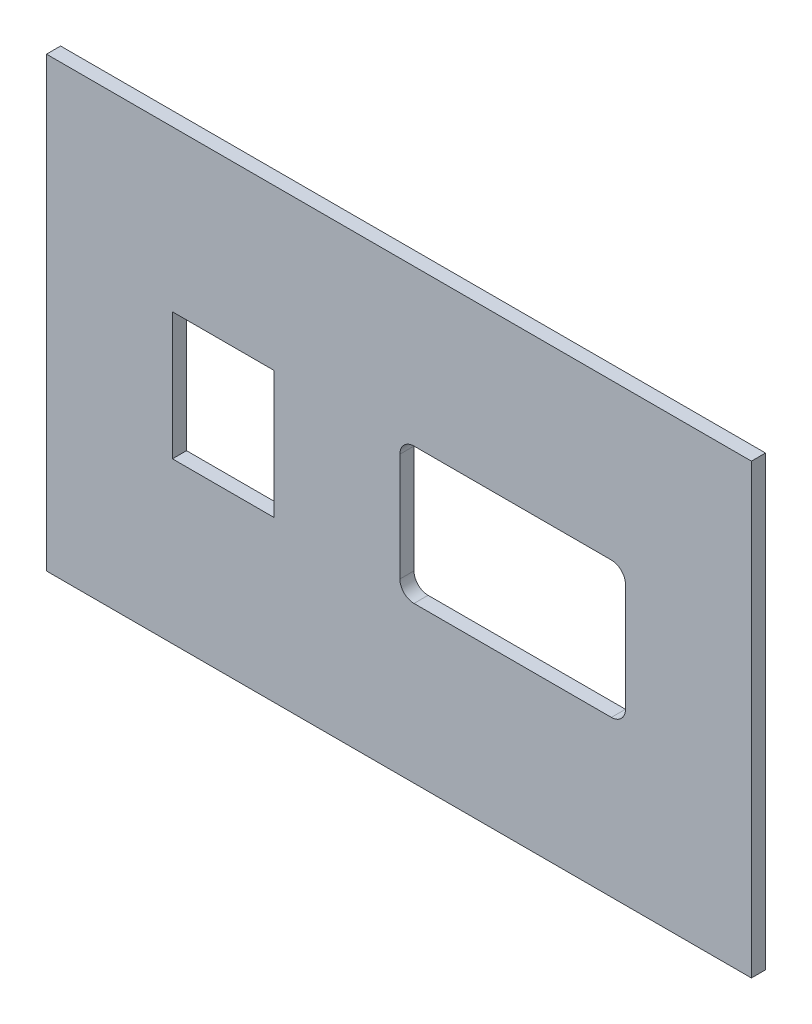
ISO-10303-21;
HEADER;
FILE_DESCRIPTION(('STEP AP214'),'2;1');
FILE_NAME('part.step','',(''),(''),'','','');
FILE_SCHEMA(('AUTOMOTIVE_DESIGN { 1 0 10303 214 1 1 1 1 }'));
ENDSEC;
DATA;
#1=APPLICATION_CONTEXT('core data for automotive mechanical design processes');
#2=APPLICATION_PROTOCOL_DEFINITION('international standard','automotive_design',2000,#1);
#3=PRODUCT_CONTEXT('',#1,'mechanical');
#4=PRODUCT('Part','Part','',(#3));
#5=PRODUCT_RELATED_PRODUCT_CATEGORY('part','',(#4));
#6=PRODUCT_DEFINITION_FORMATION('','',#4);
#7=PRODUCT_DEFINITION_CONTEXT('part definition',#1,'design');
#8=PRODUCT_DEFINITION('design','',#6,#7);
#9=PRODUCT_DEFINITION_SHAPE('','',#8);
#10=(LENGTH_UNIT() NAMED_UNIT(*) SI_UNIT(.MILLI.,.METRE.));
#11=(NAMED_UNIT(*) PLANE_ANGLE_UNIT() SI_UNIT($,.RADIAN.));
#12=(NAMED_UNIT(*) SI_UNIT($,.STERADIAN.) SOLID_ANGLE_UNIT());
#13=UNCERTAINTY_MEASURE_WITH_UNIT(LENGTH_MEASURE(1.E-05),#10,'distance_accuracy_value','');
#14=(GEOMETRIC_REPRESENTATION_CONTEXT(3) GLOBAL_UNCERTAINTY_ASSIGNED_CONTEXT((#13)) GLOBAL_UNIT_ASSIGNED_CONTEXT((#10,
#11,#12)) REPRESENTATION_CONTEXT('',''));
#15=CARTESIAN_POINT('',(0.,0.,0.));
#16=DIRECTION('',(0.,0.,1.));
#17=DIRECTION('',(1.,0.,0.));
#18=AXIS2_PLACEMENT_3D('',#15,#16,#17);
#19=CARTESIAN_POINT('',(-75.,-47.625,3.));
#20=DIRECTION('',(0.,1.,0.));
#21=DIRECTION('',(0.,0.,1.));
#22=AXIS2_PLACEMENT_3D('',#19,#20,#21);
#23=PLANE('',#22);
#24=DIRECTION('',(1.,0.,0.));
#25=VECTOR('',#24,1.);
#26=CARTESIAN_POINT('',(-75.,-47.625,0.));
#27=LINE('',#26,#25);
#28=CARTESIAN_POINT('',(-75.,-47.625,0.));
#29=VERTEX_POINT('',#28);
#30=CARTESIAN_POINT('',(75.,-47.625,0.));
#31=VERTEX_POINT('',#30);
#32=EDGE_CURVE('E156',#29,#31,#27,.T.);
#33=ORIENTED_EDGE('',*,*,#32,.T.);
#34=DIRECTION('',(0.,0.,-1.));
#35=VECTOR('',#34,1.);
#36=CARTESIAN_POINT('',(75.,-47.625,3.));
#37=LINE('',#36,#35);
#38=CARTESIAN_POINT('',(75.,-47.625,3.));
#39=VERTEX_POINT('',#38);
#40=EDGE_CURVE('E11',#39,#31,#37,.T.);
#41=ORIENTED_EDGE('',*,*,#40,.F.);
#42=DIRECTION('',(1.,0.,0.));
#43=VECTOR('',#42,1.);
#44=CARTESIAN_POINT('',(-75.,-47.625,3.));
#45=LINE('',#44,#43);
#46=CARTESIAN_POINT('',(-75.,-47.625,3.));
#47=VERTEX_POINT('',#46);
#48=EDGE_CURVE('E247',#47,#39,#45,.T.);
#49=ORIENTED_EDGE('',*,*,#48,.F.);
#50=DIRECTION('',(0.,0.,-1.));
#51=VECTOR('',#50,1.);
#52=CARTESIAN_POINT('',(-75.,-47.625,3.));
#53=LINE('',#52,#51);
#54=EDGE_CURVE('E258',#47,#29,#53,.T.);
#55=ORIENTED_EDGE('',*,*,#54,.T.);
#56=EDGE_LOOP('',(#33,#41,#49,#55));
#57=FACE_BOUND('',#56,.T.);
#58=ADVANCED_FACE('F35',(#57),#23,.F.);
#59=CARTESIAN_POINT('',(75.,47.625,3.));
#60=DIRECTION('',(1.,0.,0.));
#61=DIRECTION('',(0.,1.,0.));
#62=AXIS2_PLACEMENT_3D('',#59,#60,#61);
#63=PLANE('',#62);
#64=DIRECTION('',(0.,-1.,0.));
#65=VECTOR('',#64,1.);
#66=CARTESIAN_POINT('',(75.,47.625,0.));
#67=LINE('',#66,#65);
#68=CARTESIAN_POINT('',(75.,47.625,0.));
#69=VERTEX_POINT('',#68);
#70=EDGE_CURVE('E261',#69,#31,#67,.T.);
#71=ORIENTED_EDGE('',*,*,#70,.F.);
#72=DIRECTION('',(0.,0.,-1.));
#73=VECTOR('',#72,1.);
#74=CARTESIAN_POINT('',(75.,47.625,3.));
#75=LINE('',#74,#73);
#76=CARTESIAN_POINT('',(75.,47.625,3.));
#77=VERTEX_POINT('',#76);
#78=EDGE_CURVE('E42',#77,#69,#75,.T.);
#79=ORIENTED_EDGE('',*,*,#78,.F.);
#80=DIRECTION('',(0.,-1.,0.));
#81=VECTOR('',#80,1.);
#82=CARTESIAN_POINT('',(75.,47.625,3.));
#83=LINE('',#82,#81);
#84=EDGE_CURVE('E249',#77,#39,#83,.T.);
#85=ORIENTED_EDGE('',*,*,#84,.T.);
#86=ORIENTED_EDGE('',*,*,#40,.T.);
#87=EDGE_LOOP('',(#71,#79,#85,#86));
#88=FACE_BOUND('',#87,.T.);
#89=ADVANCED_FACE('F278',(#88),#63,.T.);
#90=CARTESIAN_POINT('',(-75.,47.625,3.));
#91=DIRECTION('',(0.,1.,0.));
#92=DIRECTION('',(0.,0.,1.));
#93=AXIS2_PLACEMENT_3D('',#90,#91,#92);
#94=PLANE('',#93);
#95=DIRECTION('',(1.,0.,0.));
#96=VECTOR('',#95,1.);
#97=CARTESIAN_POINT('',(-75.,47.625,0.));
#98=LINE('',#97,#96);
#99=CARTESIAN_POINT('',(-75.,47.625,0.));
#100=VERTEX_POINT('',#99);
#101=EDGE_CURVE('E264',#100,#69,#98,.T.);
#102=ORIENTED_EDGE('',*,*,#101,.F.);
#103=DIRECTION('',(0.,0.,-1.));
#104=VECTOR('',#103,1.);
#105=CARTESIAN_POINT('',(-75.,47.625,3.));
#106=LINE('',#105,#104);
#107=CARTESIAN_POINT('',(-75.,47.625,3.));
#108=VERTEX_POINT('',#107);
#109=EDGE_CURVE('E270',#108,#100,#106,.T.);
#110=ORIENTED_EDGE('',*,*,#109,.F.);
#111=DIRECTION('',(1.,0.,0.));
#112=VECTOR('',#111,1.);
#113=CARTESIAN_POINT('',(-75.,47.625,3.));
#114=LINE('',#113,#112);
#115=EDGE_CURVE('E253',#108,#77,#114,.T.);
#116=ORIENTED_EDGE('',*,*,#115,.T.);
#117=ORIENTED_EDGE('',*,*,#78,.T.);
#118=EDGE_LOOP('',(#102,#110,#116,#117));
#119=FACE_BOUND('',#118,.T.);
#120=ADVANCED_FACE('F274',(#119),#94,.T.);
#121=CARTESIAN_POINT('',(-75.,47.625,3.));
#122=DIRECTION('',(1.,0.,0.));
#123=DIRECTION('',(0.,1.,0.));
#124=AXIS2_PLACEMENT_3D('',#121,#122,#123);
#125=PLANE('',#124);
#126=DIRECTION('',(0.,-1.,0.));
#127=VECTOR('',#126,1.);
#128=CARTESIAN_POINT('',(-75.,47.625,0.));
#129=LINE('',#128,#127);
#130=EDGE_CURVE('E250',#100,#29,#129,.T.);
#131=ORIENTED_EDGE('',*,*,#130,.T.);
#132=ORIENTED_EDGE('',*,*,#54,.F.);
#133=DIRECTION('',(0.,-1.,0.));
#134=VECTOR('',#133,1.);
#135=CARTESIAN_POINT('',(-75.,47.625,3.));
#136=LINE('',#135,#134);
#137=EDGE_CURVE('E256',#108,#47,#136,.T.);
#138=ORIENTED_EDGE('',*,*,#137,.F.);
#139=ORIENTED_EDGE('',*,*,#109,.T.);
#140=EDGE_LOOP('',(#131,#132,#138,#139));
#141=FACE_BOUND('',#140,.T.);
#142=ADVANCED_FACE('F286',(#141),#125,.F.);
#143=CARTESIAN_POINT('',(0.,0.,3.));
#144=DIRECTION('',(0.,0.,-1.));
#145=DIRECTION('',(-1.,0.,0.));
#146=AXIS2_PLACEMENT_3D('',#143,#144,#145);
#147=PLANE('',#146);
#148=CARTESIAN_POINT('',(3.19999999999995,11.5,3.));
#149=DIRECTION('',(0.,0.,1.));
#150=DIRECTION('',(1.,0.,0.));
#151=AXIS2_PLACEMENT_3D('',#148,#149,#150);
#152=CIRCLE('',#151,3.);
#153=CARTESIAN_POINT('',(3.19999999999995,14.5,3.));
#154=VERTEX_POINT('',#153);
#155=CARTESIAN_POINT('',(0.199999999999948,11.5,3.));
#156=VERTEX_POINT('',#155);
#157=EDGE_CURVE('E150',#154,#156,#152,.T.);
#158=ORIENTED_EDGE('',*,*,#157,.F.);
#159=DIRECTION('',(1.,0.,0.));
#160=VECTOR('',#159,1.);
#161=CARTESIAN_POINT('',(0.,14.5,3.));
#162=LINE('',#161,#160);
#163=CARTESIAN_POINT('',(45.1999999999999,14.5,3.));
#164=VERTEX_POINT('',#163);
#165=EDGE_CURVE('E160',#154,#164,#162,.T.);
#166=ORIENTED_EDGE('',*,*,#165,.T.);
#167=CARTESIAN_POINT('',(45.1999999999999,11.5,3.));
#168=DIRECTION('',(0.,0.,1.));
#169=DIRECTION('',(1.,0.,0.));
#170=AXIS2_PLACEMENT_3D('',#167,#168,#169);
#171=CIRCLE('',#170,3.);
#172=CARTESIAN_POINT('',(48.2,11.5,3.));
#173=VERTEX_POINT('',#172);
#174=EDGE_CURVE('E184',#164,#173,#171,.F.);
#175=ORIENTED_EDGE('',*,*,#174,.T.);
#176=DIRECTION('',(0.,-1.,0.));
#177=VECTOR('',#176,1.);
#178=CARTESIAN_POINT('',(48.1999999999999,0.,3.));
#179=LINE('',#178,#177);
#180=CARTESIAN_POINT('',(48.1999999999999,-11.5,3.));
#181=VERTEX_POINT('',#180);
#182=EDGE_CURVE('E49',#173,#181,#179,.T.);
#183=ORIENTED_EDGE('',*,*,#182,.T.);
#184=CARTESIAN_POINT('',(45.1999999999999,-11.5,3.));
#185=DIRECTION('',(0.,0.,1.));
#186=DIRECTION('',(1.,0.,0.));
#187=AXIS2_PLACEMENT_3D('',#184,#185,#186);
#188=CIRCLE('',#187,3.);
#189=CARTESIAN_POINT('',(45.1999999999999,-14.5,3.));
#190=VERTEX_POINT('',#189);
#191=EDGE_CURVE('E181',#190,#181,#188,.T.);
#192=ORIENTED_EDGE('',*,*,#191,.F.);
#193=DIRECTION('',(1.,0.,0.));
#194=VECTOR('',#193,1.);
#195=CARTESIAN_POINT('',(0.,-14.5,3.));
#196=LINE('',#195,#194);
#197=CARTESIAN_POINT('',(3.19999999999995,-14.5,3.));
#198=VERTEX_POINT('',#197);
#199=EDGE_CURVE('E179',#198,#190,#196,.T.);
#200=ORIENTED_EDGE('',*,*,#199,.F.);
#201=CARTESIAN_POINT('',(3.19999999999995,-11.5,3.));
#202=DIRECTION('',(0.,0.,1.));
#203=DIRECTION('',(1.,0.,0.));
#204=AXIS2_PLACEMENT_3D('',#201,#202,#203);
#205=CIRCLE('',#204,3.);
#206=CARTESIAN_POINT('',(0.199999999999952,-11.5,3.));
#207=VERTEX_POINT('',#206);
#208=EDGE_CURVE('E175',#207,#198,#205,.T.);
#209=ORIENTED_EDGE('',*,*,#208,.F.);
#210=DIRECTION('',(0.,-1.,0.));
#211=VECTOR('',#210,1.);
#212=CARTESIAN_POINT('',(0.19999999999995,0.,3.));
#213=LINE('',#212,#211);
#214=EDGE_CURVE('E173',#156,#207,#213,.T.);
#215=ORIENTED_EDGE('',*,*,#214,.F.);
#216=EDGE_LOOP('',(#158,#166,#175,#183,#192,#200,#209,#215));
#217=FACE_BOUND('',#216,.T.);
#218=DIRECTION('',(1.,0.,0.));
#219=VECTOR('',#218,1.);
#220=CARTESIAN_POINT('',(0.,13.55,3.));
#221=LINE('',#220,#219);
#222=CARTESIAN_POINT('',(-48.2,13.55,3.));
#223=VERTEX_POINT('',#222);
#224=CARTESIAN_POINT('',(-26.6,13.55,3.));
#225=VERTEX_POINT('',#224);
#226=EDGE_CURVE('E222',#223,#225,#221,.T.);
#227=ORIENTED_EDGE('',*,*,#226,.T.);
#228=DIRECTION('',(0.,-1.,0.));
#229=VECTOR('',#228,1.);
#230=CARTESIAN_POINT('',(-26.6,0.,3.));
#231=LINE('',#230,#229);
#232=CARTESIAN_POINT('',(-26.6,-13.55,3.));
#233=VERTEX_POINT('',#232);
#234=EDGE_CURVE('E219',#225,#233,#231,.T.);
#235=ORIENTED_EDGE('',*,*,#234,.T.);
#236=DIRECTION('',(1.,0.,0.));
#237=VECTOR('',#236,1.);
#238=CARTESIAN_POINT('',(0.,-13.55,3.));
#239=LINE('',#238,#237);
#240=CARTESIAN_POINT('',(-48.2,-13.55,3.));
#241=VERTEX_POINT('',#240);
#242=EDGE_CURVE('E228',#241,#233,#239,.T.);
#243=ORIENTED_EDGE('',*,*,#242,.F.);
#244=DIRECTION('',(0.,-1.,0.));
#245=VECTOR('',#244,1.);
#246=CARTESIAN_POINT('',(-48.2,0.,3.));
#247=LINE('',#246,#245);
#248=EDGE_CURVE('E226',#223,#241,#247,.T.);
#249=ORIENTED_EDGE('',*,*,#248,.F.);
#250=EDGE_LOOP('',(#227,#235,#243,#249));
#251=FACE_BOUND('',#250,.T.);
#252=ORIENTED_EDGE('',*,*,#48,.T.);
#253=ORIENTED_EDGE('',*,*,#84,.F.);
#254=ORIENTED_EDGE('',*,*,#115,.F.);
#255=ORIENTED_EDGE('',*,*,#137,.T.);
#256=EDGE_LOOP('',(#252,#253,#254,#255));
#257=FACE_BOUND('',#256,.T.);
#258=ADVANCED_FACE('F170',(#217,#251,#257),#147,.F.);
#259=CARTESIAN_POINT('',(0.,0.,0.));
#260=DIRECTION('',(0.,0.,-1.));
#261=DIRECTION('',(-1.,0.,0.));
#262=AXIS2_PLACEMENT_3D('',#259,#260,#261);
#263=PLANE('',#262);
#264=DIRECTION('',(1.,0.,0.));
#265=VECTOR('',#264,1.);
#266=CARTESIAN_POINT('',(0.,14.5,0.));
#267=LINE('',#266,#265);
#268=CARTESIAN_POINT('',(3.19999999999995,14.5,0.));
#269=VERTEX_POINT('',#268);
#270=CARTESIAN_POINT('',(45.1999999999999,14.5,0.));
#271=VERTEX_POINT('',#270);
#272=EDGE_CURVE('E186',#269,#271,#267,.T.);
#273=ORIENTED_EDGE('',*,*,#272,.F.);
#274=CARTESIAN_POINT('',(3.19999999999995,11.5,0.));
#275=DIRECTION('',(0.,0.,1.));
#276=DIRECTION('',(1.,0.,0.));
#277=AXIS2_PLACEMENT_3D('',#274,#275,#276);
#278=CIRCLE('',#277,3.);
#279=CARTESIAN_POINT('',(0.199999999999948,11.5,0.));
#280=VERTEX_POINT('',#279);
#281=EDGE_CURVE('E153',#269,#280,#278,.T.);
#282=ORIENTED_EDGE('',*,*,#281,.T.);
#283=DIRECTION('',(0.,-1.,0.));
#284=VECTOR('',#283,1.);
#285=CARTESIAN_POINT('',(0.19999999999995,0.,0.));
#286=LINE('',#285,#284);
#287=CARTESIAN_POINT('',(0.199999999999952,-11.5,0.));
#288=VERTEX_POINT('',#287);
#289=EDGE_CURVE('E190',#280,#288,#286,.T.);
#290=ORIENTED_EDGE('',*,*,#289,.T.);
#291=CARTESIAN_POINT('',(3.19999999999995,-11.5,0.));
#292=DIRECTION('',(0.,0.,1.));
#293=DIRECTION('',(1.,0.,0.));
#294=AXIS2_PLACEMENT_3D('',#291,#292,#293);
#295=CIRCLE('',#294,3.);
#296=CARTESIAN_POINT('',(3.19999999999995,-14.5,0.));
#297=VERTEX_POINT('',#296);
#298=EDGE_CURVE('E193',#288,#297,#295,.T.);
#299=ORIENTED_EDGE('',*,*,#298,.T.);
#300=DIRECTION('',(1.,0.,0.));
#301=VECTOR('',#300,1.);
#302=CARTESIAN_POINT('',(0.,-14.5,0.));
#303=LINE('',#302,#301);
#304=CARTESIAN_POINT('',(45.1999999999999,-14.5,0.));
#305=VERTEX_POINT('',#304);
#306=EDGE_CURVE('E196',#297,#305,#303,.T.);
#307=ORIENTED_EDGE('',*,*,#306,.T.);
#308=CARTESIAN_POINT('',(45.1999999999999,-11.5,0.));
#309=DIRECTION('',(0.,0.,1.));
#310=DIRECTION('',(1.,0.,0.));
#311=AXIS2_PLACEMENT_3D('',#308,#309,#310);
#312=CIRCLE('',#311,3.);
#313=CARTESIAN_POINT('',(48.1999999999999,-11.5,0.));
#314=VERTEX_POINT('',#313);
#315=EDGE_CURVE('E199',#305,#314,#312,.T.);
#316=ORIENTED_EDGE('',*,*,#315,.T.);
#317=DIRECTION('',(0.,-1.,0.));
#318=VECTOR('',#317,1.);
#319=CARTESIAN_POINT('',(48.1999999999999,0.,0.));
#320=LINE('',#319,#318);
#321=CARTESIAN_POINT('',(48.2,11.5,0.));
#322=VERTEX_POINT('',#321);
#323=EDGE_CURVE('E202',#322,#314,#320,.T.);
#324=ORIENTED_EDGE('',*,*,#323,.F.);
#325=CARTESIAN_POINT('',(45.1999999999999,11.5,0.));
#326=DIRECTION('',(0.,0.,1.));
#327=DIRECTION('',(1.,0.,0.));
#328=AXIS2_PLACEMENT_3D('',#325,#326,#327);
#329=CIRCLE('',#328,3.);
#330=EDGE_CURVE('E167',#271,#322,#329,.F.);
#331=ORIENTED_EDGE('',*,*,#330,.F.);
#332=EDGE_LOOP('',(#273,#282,#290,#299,#307,#316,#324,#331));
#333=FACE_BOUND('',#332,.T.);
#334=DIRECTION('',(0.,-1.,0.));
#335=VECTOR('',#334,1.);
#336=CARTESIAN_POINT('',(-26.6,0.,0.));
#337=LINE('',#336,#335);
#338=CARTESIAN_POINT('',(-26.6,13.55,0.));
#339=VERTEX_POINT('',#338);
#340=CARTESIAN_POINT('',(-26.6,-13.55,0.));
#341=VERTEX_POINT('',#340);
#342=EDGE_CURVE('E231',#339,#341,#337,.T.);
#343=ORIENTED_EDGE('',*,*,#342,.F.);
#344=DIRECTION('',(1.,0.,0.));
#345=VECTOR('',#344,1.);
#346=CARTESIAN_POINT('',(0.,13.55,0.));
#347=LINE('',#346,#345);
#348=CARTESIAN_POINT('',(-48.2,13.55,0.));
#349=VERTEX_POINT('',#348);
#350=EDGE_CURVE('E233',#349,#339,#347,.T.);
#351=ORIENTED_EDGE('',*,*,#350,.F.);
#352=DIRECTION('',(0.,-1.,0.));
#353=VECTOR('',#352,1.);
#354=CARTESIAN_POINT('',(-48.2,0.,0.));
#355=LINE('',#354,#353);
#356=CARTESIAN_POINT('',(-48.2,-13.55,0.));
#357=VERTEX_POINT('',#356);
#358=EDGE_CURVE('E236',#349,#357,#355,.T.);
#359=ORIENTED_EDGE('',*,*,#358,.T.);
#360=DIRECTION('',(1.,0.,0.));
#361=VECTOR('',#360,1.);
#362=CARTESIAN_POINT('',(0.,-13.55,0.));
#363=LINE('',#362,#361);
#364=EDGE_CURVE('E223',#357,#341,#363,.T.);
#365=ORIENTED_EDGE('',*,*,#364,.T.);
#366=EDGE_LOOP('',(#343,#351,#359,#365));
#367=FACE_BOUND('',#366,.T.);
#368=ORIENTED_EDGE('',*,*,#32,.F.);
#369=ORIENTED_EDGE('',*,*,#130,.F.);
#370=ORIENTED_EDGE('',*,*,#101,.T.);
#371=ORIENTED_EDGE('',*,*,#70,.T.);
#372=EDGE_LOOP('',(#368,#369,#370,#371));
#373=FACE_BOUND('',#372,.T.);
#374=ADVANCED_FACE('F283',(#333,#367,#373),#263,.T.);
#375=CARTESIAN_POINT('',(-26.6,0.,3.));
#376=DIRECTION('',(1.,0.,0.));
#377=DIRECTION('',(0.,0.,-1.));
#378=AXIS2_PLACEMENT_3D('',#375,#376,#377);
#379=PLANE('',#378);
#380=ORIENTED_EDGE('',*,*,#342,.T.);
#381=DIRECTION('',(0.,0.,-1.));
#382=VECTOR('',#381,1.);
#383=CARTESIAN_POINT('',(-26.6,-13.55,3.));
#384=LINE('',#383,#382);
#385=EDGE_CURVE('E230',#233,#341,#384,.T.);
#386=ORIENTED_EDGE('',*,*,#385,.F.);
#387=ORIENTED_EDGE('',*,*,#234,.F.);
#388=DIRECTION('',(0.,0.,-1.));
#389=VECTOR('',#388,1.);
#390=CARTESIAN_POINT('',(-26.6,13.55,3.));
#391=LINE('',#390,#389);
#392=EDGE_CURVE('E188',#225,#339,#391,.T.);
#393=ORIENTED_EDGE('',*,*,#392,.T.);
#394=EDGE_LOOP('',(#380,#386,#387,#393));
#395=FACE_BOUND('',#394,.T.);
#396=ADVANCED_FACE('F297',(#395),#379,.F.);
#397=CARTESIAN_POINT('',(0.,13.55,3.));
#398=DIRECTION('',(0.,1.,0.));
#399=DIRECTION('',(-1.,0.,0.));
#400=AXIS2_PLACEMENT_3D('',#397,#398,#399);
#401=PLANE('',#400);
#402=ORIENTED_EDGE('',*,*,#350,.T.);
#403=ORIENTED_EDGE('',*,*,#392,.F.);
#404=ORIENTED_EDGE('',*,*,#226,.F.);
#405=DIRECTION('',(0.,0.,-1.));
#406=VECTOR('',#405,1.);
#407=CARTESIAN_POINT('',(-48.2,13.55,3.));
#408=LINE('',#407,#406);
#409=EDGE_CURVE('E244',#223,#349,#408,.T.);
#410=ORIENTED_EDGE('',*,*,#409,.T.);
#411=EDGE_LOOP('',(#402,#403,#404,#410));
#412=FACE_BOUND('',#411,.T.);
#413=ADVANCED_FACE('F335',(#412),#401,.F.);
#414=CARTESIAN_POINT('',(-48.2,0.,3.));
#415=DIRECTION('',(1.,0.,0.));
#416=DIRECTION('',(0.,1.,0.));
#417=AXIS2_PLACEMENT_3D('',#414,#415,#416);
#418=PLANE('',#417);
#419=ORIENTED_EDGE('',*,*,#358,.F.);
#420=ORIENTED_EDGE('',*,*,#409,.F.);
#421=ORIENTED_EDGE('',*,*,#248,.T.);
#422=DIRECTION('',(0.,0.,-1.));
#423=VECTOR('',#422,1.);
#424=CARTESIAN_POINT('',(-48.2,-13.55,3.));
#425=LINE('',#424,#423);
#426=EDGE_CURVE('E57',#241,#357,#425,.T.);
#427=ORIENTED_EDGE('',*,*,#426,.T.);
#428=EDGE_LOOP('',(#419,#420,#421,#427));
#429=FACE_BOUND('',#428,.T.);
#430=ADVANCED_FACE('F344',(#429),#418,.T.);
#431=CARTESIAN_POINT('',(0.,-13.55,3.));
#432=DIRECTION('',(0.,1.,0.));
#433=DIRECTION('',(0.,0.,1.));
#434=AXIS2_PLACEMENT_3D('',#431,#432,#433);
#435=PLANE('',#434);
#436=ORIENTED_EDGE('',*,*,#364,.F.);
#437=ORIENTED_EDGE('',*,*,#426,.F.);
#438=ORIENTED_EDGE('',*,*,#242,.T.);
#439=ORIENTED_EDGE('',*,*,#385,.T.);
#440=EDGE_LOOP('',(#436,#437,#438,#439));
#441=FACE_BOUND('',#440,.T.);
#442=ADVANCED_FACE('F354',(#441),#435,.T.);
#443=CARTESIAN_POINT('',(0.,14.5,3.));
#444=DIRECTION('',(0.,1.,0.));
#445=DIRECTION('',(-1.,0.,0.));
#446=AXIS2_PLACEMENT_3D('',#443,#444,#445);
#447=PLANE('',#446);
#448=ORIENTED_EDGE('',*,*,#272,.T.);
#449=DIRECTION('',(0.,0.,-1.));
#450=VECTOR('',#449,1.);
#451=CARTESIAN_POINT('',(45.1999999999999,14.5,3.));
#452=LINE('',#451,#450);
#453=EDGE_CURVE('E163',#164,#271,#452,.T.);
#454=ORIENTED_EDGE('',*,*,#453,.F.);
#455=ORIENTED_EDGE('',*,*,#165,.F.);
#456=DIRECTION('',(0.,0.,-1.));
#457=VECTOR('',#456,1.);
#458=CARTESIAN_POINT('',(3.19999999999995,14.5,3.));
#459=LINE('',#458,#457);
#460=EDGE_CURVE('E146',#154,#269,#459,.T.);
#461=ORIENTED_EDGE('',*,*,#460,.T.);
#462=EDGE_LOOP('',(#448,#454,#455,#461));
#463=FACE_BOUND('',#462,.T.);
#464=ADVANCED_FACE('F161',(#463),#447,.F.);
#465=CARTESIAN_POINT('',(3.19999999999995,11.5,3.));
#466=DIRECTION('',(0.,0.,-1.));
#467=DIRECTION('',(-1.,0.,0.));
#468=AXIS2_PLACEMENT_3D('',#465,#466,#467);
#469=CYLINDRICAL_SURFACE('',#468,3.);
#470=ORIENTED_EDGE('',*,*,#281,.F.);
#471=ORIENTED_EDGE('',*,*,#460,.F.);
#472=ORIENTED_EDGE('',*,*,#157,.T.);
#473=DIRECTION('',(0.,0.,-1.));
#474=VECTOR('',#473,1.);
#475=CARTESIAN_POINT('',(0.199999999999948,11.5,3.));
#476=LINE('',#475,#474);
#477=EDGE_CURVE('E157',#156,#280,#476,.T.);
#478=ORIENTED_EDGE('',*,*,#477,.T.);
#479=EDGE_LOOP('',(#470,#471,#472,#478));
#480=FACE_BOUND('',#479,.T.);
#481=ADVANCED_FACE('F148',(#480),#469,.F.);
#482=CARTESIAN_POINT('',(0.19999999999995,0.,3.));
#483=DIRECTION('',(1.,0.,0.));
#484=DIRECTION('',(0.,1.,0.));
#485=AXIS2_PLACEMENT_3D('',#482,#483,#484);
#486=PLANE('',#485);
#487=ORIENTED_EDGE('',*,*,#289,.F.);
#488=ORIENTED_EDGE('',*,*,#477,.F.);
#489=ORIENTED_EDGE('',*,*,#214,.T.);
#490=DIRECTION('',(0.,0.,-1.));
#491=VECTOR('',#490,1.);
#492=CARTESIAN_POINT('',(0.199999999999952,-11.5,3.));
#493=LINE('',#492,#491);
#494=EDGE_CURVE('E216',#207,#288,#493,.T.);
#495=ORIENTED_EDGE('',*,*,#494,.T.);
#496=EDGE_LOOP('',(#487,#488,#489,#495));
#497=FACE_BOUND('',#496,.T.);
#498=ADVANCED_FACE('F380',(#497),#486,.T.);
#499=CARTESIAN_POINT('',(3.19999999999995,-11.5,3.));
#500=DIRECTION('',(0.,0.,-1.));
#501=DIRECTION('',(-1.,0.,0.));
#502=AXIS2_PLACEMENT_3D('',#499,#500,#501);
#503=CYLINDRICAL_SURFACE('',#502,3.);
#504=ORIENTED_EDGE('',*,*,#298,.F.);
#505=ORIENTED_EDGE('',*,*,#494,.F.);
#506=ORIENTED_EDGE('',*,*,#208,.T.);
#507=DIRECTION('',(0.,0.,-1.));
#508=VECTOR('',#507,1.);
#509=CARTESIAN_POINT('',(3.19999999999995,-14.5,3.));
#510=LINE('',#509,#508);
#511=EDGE_CURVE('E214',#198,#297,#510,.T.);
#512=ORIENTED_EDGE('',*,*,#511,.T.);
#513=EDGE_LOOP('',(#504,#505,#506,#512));
#514=FACE_BOUND('',#513,.T.);
#515=ADVANCED_FACE('F389',(#514),#503,.F.);
#516=CARTESIAN_POINT('',(0.,-14.5,3.));
#517=DIRECTION('',(0.,1.,0.));
#518=DIRECTION('',(0.,0.,1.));
#519=AXIS2_PLACEMENT_3D('',#516,#517,#518);
#520=PLANE('',#519);
#521=ORIENTED_EDGE('',*,*,#306,.F.);
#522=ORIENTED_EDGE('',*,*,#511,.F.);
#523=ORIENTED_EDGE('',*,*,#199,.T.);
#524=DIRECTION('',(0.,0.,-1.));
#525=VECTOR('',#524,1.);
#526=CARTESIAN_POINT('',(45.1999999999999,-14.5,3.));
#527=LINE('',#526,#525);
#528=EDGE_CURVE('E212',#190,#305,#527,.T.);
#529=ORIENTED_EDGE('',*,*,#528,.T.);
#530=EDGE_LOOP('',(#521,#522,#523,#529));
#531=FACE_BOUND('',#530,.T.);
#532=ADVANCED_FACE('F399',(#531),#520,.T.);
#533=CARTESIAN_POINT('',(45.1999999999999,-11.5,3.));
#534=DIRECTION('',(0.,0.,-1.));
#535=DIRECTION('',(-1.,0.,0.));
#536=AXIS2_PLACEMENT_3D('',#533,#534,#535);
#537=CYLINDRICAL_SURFACE('',#536,3.);
#538=ORIENTED_EDGE('',*,*,#315,.F.);
#539=ORIENTED_EDGE('',*,*,#528,.F.);
#540=ORIENTED_EDGE('',*,*,#191,.T.);
#541=DIRECTION('',(0.,0.,-1.));
#542=VECTOR('',#541,1.);
#543=CARTESIAN_POINT('',(48.1999999999999,-11.5,3.));
#544=LINE('',#543,#542);
#545=EDGE_CURVE('E210',#181,#314,#544,.T.);
#546=ORIENTED_EDGE('',*,*,#545,.T.);
#547=EDGE_LOOP('',(#538,#539,#540,#546));
#548=FACE_BOUND('',#547,.T.);
#549=ADVANCED_FACE('F409',(#548),#537,.F.);
#550=CARTESIAN_POINT('',(48.1999999999999,0.,3.));
#551=DIRECTION('',(1.,0.,0.));
#552=DIRECTION('',(0.,1.,0.));
#553=AXIS2_PLACEMENT_3D('',#550,#551,#552);
#554=PLANE('',#553);
#555=ORIENTED_EDGE('',*,*,#323,.T.);
#556=ORIENTED_EDGE('',*,*,#545,.F.);
#557=ORIENTED_EDGE('',*,*,#182,.F.);
#558=DIRECTION('',(0.,0.,-1.));
#559=VECTOR('',#558,1.);
#560=CARTESIAN_POINT('',(48.2,11.5,3.));
#561=LINE('',#560,#559);
#562=EDGE_CURVE('E208',#173,#322,#561,.T.);
#563=ORIENTED_EDGE('',*,*,#562,.T.);
#564=EDGE_LOOP('',(#555,#556,#557,#563));
#565=FACE_BOUND('',#564,.T.);
#566=ADVANCED_FACE('F419',(#565),#554,.F.);
#567=CARTESIAN_POINT('',(45.1999999999999,11.5,3.));
#568=DIRECTION('',(0.,0.,-1.));
#569=DIRECTION('',(-1.,0.,0.));
#570=AXIS2_PLACEMENT_3D('',#567,#568,#569);
#571=CYLINDRICAL_SURFACE('',#570,3.);
#572=ORIENTED_EDGE('',*,*,#330,.T.);
#573=ORIENTED_EDGE('',*,*,#562,.F.);
#574=ORIENTED_EDGE('',*,*,#174,.F.);
#575=ORIENTED_EDGE('',*,*,#453,.T.);
#576=EDGE_LOOP('',(#572,#573,#574,#575));
#577=FACE_BOUND('',#576,.T.);
#578=ADVANCED_FACE('F429',(#577),#571,.F.);
#579=CLOSED_SHELL('',(#58,#89,#120,#142,#258,#374,#396,#413,#430,#442,#464,#481,#498,#515,#532,
#549,#566,#578));
#580=MANIFOLD_SOLID_BREP('B2',#579);
#581=ADVANCED_BREP_SHAPE_REPRESENTATION('',(#18,#580),#14);
#582=SHAPE_DEFINITION_REPRESENTATION(#9,#581);
ENDSEC;
END-ISO-10303-21;
